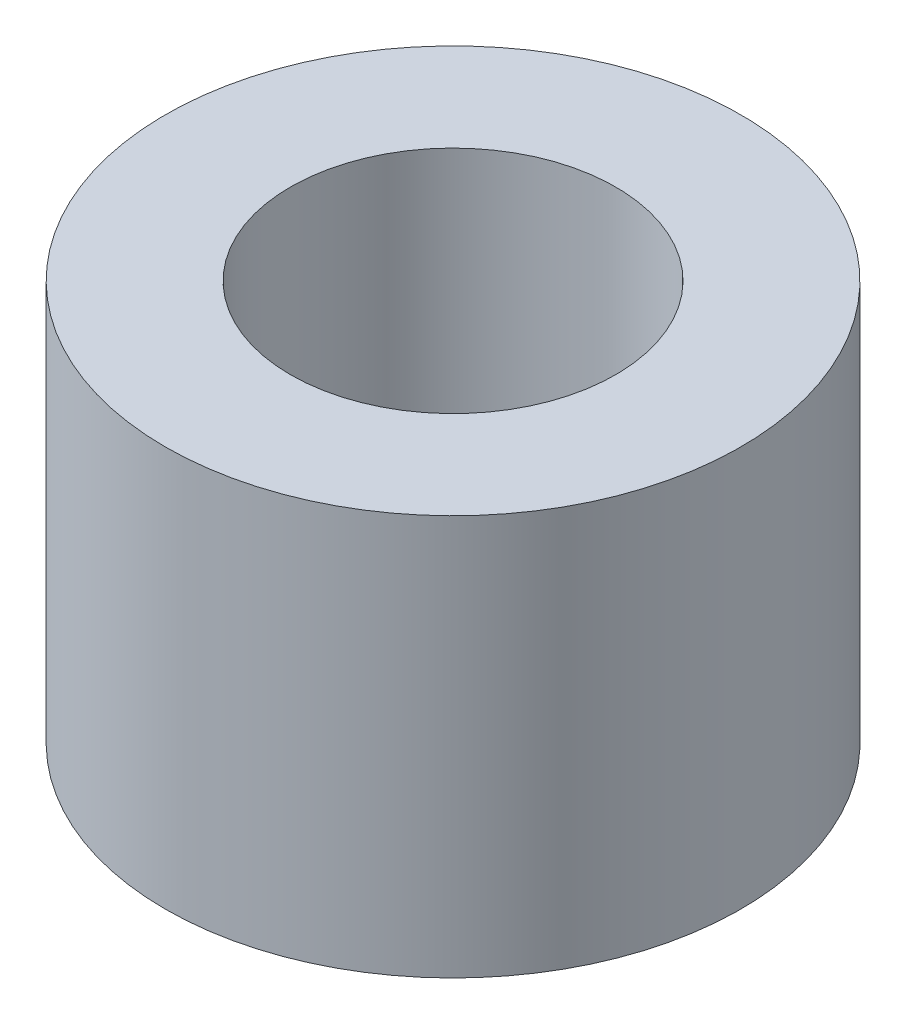
ISO-10303-21;
HEADER;
FILE_DESCRIPTION(('STEP AP214'),'2;1');
FILE_NAME('part.step','',(''),(''),'','','');
FILE_SCHEMA(('AUTOMOTIVE_DESIGN { 1 0 10303 214 1 1 1 1 }'));
ENDSEC;
DATA;
#1=APPLICATION_CONTEXT('core data for automotive mechanical design processes');
#2=APPLICATION_PROTOCOL_DEFINITION('international standard','automotive_design',2000,#1);
#3=PRODUCT_CONTEXT('',#1,'mechanical');
#4=PRODUCT('Part','Part','',(#3));
#5=PRODUCT_RELATED_PRODUCT_CATEGORY('part','',(#4));
#6=PRODUCT_DEFINITION_FORMATION('','',#4);
#7=PRODUCT_DEFINITION_CONTEXT('part definition',#1,'design');
#8=PRODUCT_DEFINITION('design','',#6,#7);
#9=PRODUCT_DEFINITION_SHAPE('','',#8);
#10=(LENGTH_UNIT() NAMED_UNIT(*) SI_UNIT(.MILLI.,.METRE.));
#11=(NAMED_UNIT(*) PLANE_ANGLE_UNIT() SI_UNIT($,.RADIAN.));
#12=(NAMED_UNIT(*) SI_UNIT($,.STERADIAN.) SOLID_ANGLE_UNIT());
#13=UNCERTAINTY_MEASURE_WITH_UNIT(LENGTH_MEASURE(1.E-05),#10,'distance_accuracy_value','');
#14=(GEOMETRIC_REPRESENTATION_CONTEXT(3) GLOBAL_UNCERTAINTY_ASSIGNED_CONTEXT((#13)) GLOBAL_UNIT_ASSIGNED_CONTEXT((#10,
#11,#12)) REPRESENTATION_CONTEXT('',''));
#15=CARTESIAN_POINT('',(0.,0.,0.));
#16=DIRECTION('',(0.,0.,1.));
#17=DIRECTION('',(1.,0.,0.));
#18=AXIS2_PLACEMENT_3D('',#15,#16,#17);
#19=CARTESIAN_POINT('',(0.,1.6,0.));
#20=DIRECTION('',(0.,1.,0.));
#21=DIRECTION('',(0.,0.,1.));
#22=AXIS2_PLACEMENT_3D('',#19,#20,#21);
#23=PLANE('',#22);
#24=CARTESIAN_POINT('',(0.,1.6,0.));
#25=DIRECTION('',(0.,1.,0.));
#26=DIRECTION('',(0.,0.,1.));
#27=AXIS2_PLACEMENT_3D('',#24,#25,#26);
#28=CIRCLE('',#27,2.3);
#29=CARTESIAN_POINT('',(0.,1.6,2.3));
#30=VERTEX_POINT('',#29);
#31=EDGE_CURVE('E10',#30,#30,#28,.T.);
#32=ORIENTED_EDGE('',*,*,#31,.T.);
#33=EDGE_LOOP('',(#32));
#34=FACE_BOUND('',#33,.T.);
#35=CARTESIAN_POINT('',(0.,1.6,0.));
#36=DIRECTION('',(0.,1.,0.));
#37=DIRECTION('',(0.,0.,1.));
#38=AXIS2_PLACEMENT_3D('',#35,#36,#37);
#39=CIRCLE('',#38,1.3);
#40=CARTESIAN_POINT('',(0.,1.6,1.3));
#41=VERTEX_POINT('',#40);
#42=EDGE_CURVE('E42',#41,#41,#39,.T.);
#43=ORIENTED_EDGE('',*,*,#42,.F.);
#44=EDGE_LOOP('',(#43));
#45=FACE_BOUND('',#44,.T.);
#46=ADVANCED_FACE('F31',(#34,#45),#23,.T.);
#47=CARTESIAN_POINT('',(0.,-1.6,0.));
#48=DIRECTION('',(0.,1.,0.));
#49=DIRECTION('',(0.,0.,1.));
#50=AXIS2_PLACEMENT_3D('',#47,#48,#49);
#51=PLANE('',#50);
#52=CARTESIAN_POINT('',(0.,-1.6,0.));
#53=DIRECTION('',(0.,1.,0.));
#54=DIRECTION('',(0.,0.,1.));
#55=AXIS2_PLACEMENT_3D('',#52,#53,#54);
#56=CIRCLE('',#55,2.3);
#57=CARTESIAN_POINT('',(0.,-1.6,2.3));
#58=VERTEX_POINT('',#57);
#59=EDGE_CURVE('E35',#58,#58,#56,.T.);
#60=ORIENTED_EDGE('',*,*,#59,.F.);
#61=EDGE_LOOP('',(#60));
#62=FACE_BOUND('',#61,.T.);
#63=CARTESIAN_POINT('',(0.,-1.6,0.));
#64=DIRECTION('',(0.,1.,0.));
#65=DIRECTION('',(0.,0.,1.));
#66=AXIS2_PLACEMENT_3D('',#63,#64,#65);
#67=CIRCLE('',#66,1.3);
#68=CARTESIAN_POINT('',(0.,-1.6,1.3));
#69=VERTEX_POINT('',#68);
#70=EDGE_CURVE('E44',#69,#69,#67,.T.);
#71=ORIENTED_EDGE('',*,*,#70,.T.);
#72=EDGE_LOOP('',(#71));
#73=FACE_BOUND('',#72,.T.);
#74=ADVANCED_FACE('F54',(#62,#73),#51,.F.);
#75=CARTESIAN_POINT('',(0.,1.6,0.));
#76=DIRECTION('',(0.,-1.,0.));
#77=DIRECTION('',(0.,0.,-1.));
#78=AXIS2_PLACEMENT_3D('',#75,#76,#77);
#79=CYLINDRICAL_SURFACE('',#78,2.3);
#80=ORIENTED_EDGE('',*,*,#31,.F.);
#81=EDGE_LOOP('',(#80));
#82=FACE_BOUND('',#81,.T.);
#83=ORIENTED_EDGE('',*,*,#59,.T.);
#84=EDGE_LOOP('',(#83));
#85=FACE_BOUND('',#84,.T.);
#86=ADVANCED_FACE('F33',(#82,#85),#79,.T.);
#87=CARTESIAN_POINT('',(0.,1.6,0.));
#88=DIRECTION('',(0.,-1.,0.));
#89=DIRECTION('',(0.,0.,-1.));
#90=AXIS2_PLACEMENT_3D('',#87,#88,#89);
#91=CYLINDRICAL_SURFACE('',#90,1.3);
#92=ORIENTED_EDGE('',*,*,#42,.T.);
#93=EDGE_LOOP('',(#92));
#94=FACE_BOUND('',#93,.T.);
#95=ORIENTED_EDGE('',*,*,#70,.F.);
#96=EDGE_LOOP('',(#95));
#97=FACE_BOUND('',#96,.T.);
#98=ADVANCED_FACE('F50',(#94,#97),#91,.F.);
#99=CLOSED_SHELL('',(#46,#74,#86,#98));
#100=MANIFOLD_SOLID_BREP('B2',#99);
#101=ADVANCED_BREP_SHAPE_REPRESENTATION('',(#18,#100),#14);
#102=SHAPE_DEFINITION_REPRESENTATION(#9,#101);
ENDSEC;
END-ISO-10303-21;
